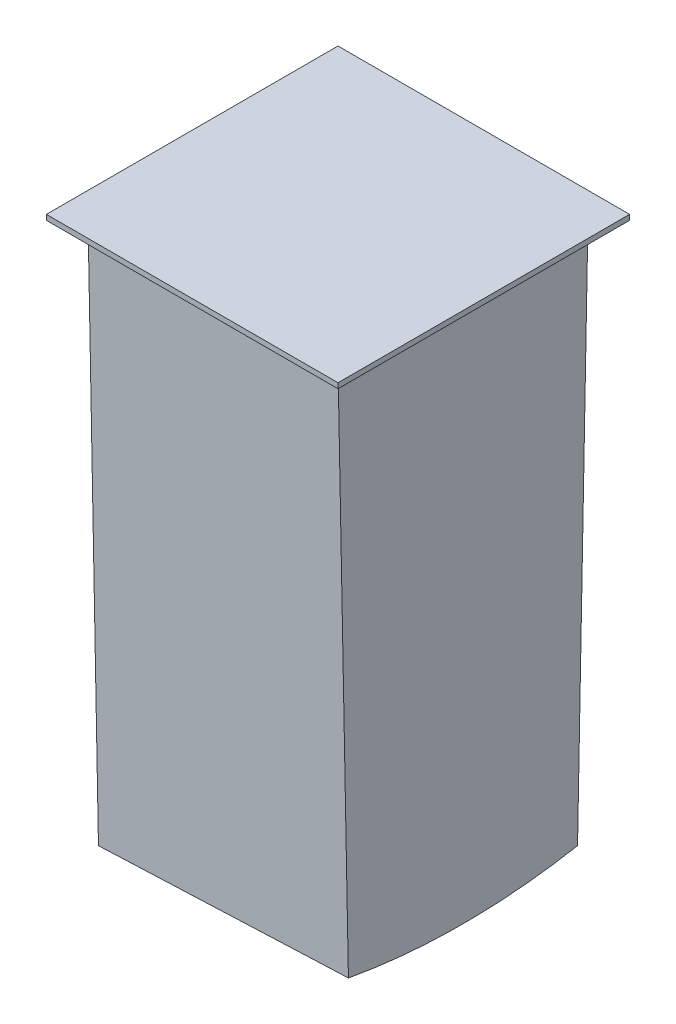
ISO-10303-21;
HEADER;
FILE_DESCRIPTION(('STEP AP214'),'2;1');
FILE_NAME('part.step','',(''),(''),'','','');
FILE_SCHEMA(('AUTOMOTIVE_DESIGN { 1 0 10303 214 1 1 1 1 }'));
ENDSEC;
DATA;
#1=APPLICATION_CONTEXT('core data for automotive mechanical design processes');
#2=APPLICATION_PROTOCOL_DEFINITION('international standard','automotive_design',2000,#1);
#3=PRODUCT_CONTEXT('',#1,'mechanical');
#4=PRODUCT('Part','Part','',(#3));
#5=PRODUCT_RELATED_PRODUCT_CATEGORY('part','',(#4));
#6=PRODUCT_DEFINITION_FORMATION('','',#4);
#7=PRODUCT_DEFINITION_CONTEXT('part definition',#1,'design');
#8=PRODUCT_DEFINITION('design','',#6,#7);
#9=PRODUCT_DEFINITION_SHAPE('','',#8);
#10=(LENGTH_UNIT() NAMED_UNIT(*) SI_UNIT(.MILLI.,.METRE.));
#11=(NAMED_UNIT(*) PLANE_ANGLE_UNIT() SI_UNIT($,.RADIAN.));
#12=(NAMED_UNIT(*) SI_UNIT($,.STERADIAN.) SOLID_ANGLE_UNIT());
#13=UNCERTAINTY_MEASURE_WITH_UNIT(LENGTH_MEASURE(1.E-05),#10,'distance_accuracy_value','');
#14=(GEOMETRIC_REPRESENTATION_CONTEXT(3) GLOBAL_UNCERTAINTY_ASSIGNED_CONTEXT((#13)) GLOBAL_UNIT_ASSIGNED_CONTEXT((#10,
#11,#12)) REPRESENTATION_CONTEXT('',''));
#15=CARTESIAN_POINT('',(0.,0.,0.));
#16=DIRECTION('',(0.,0.,1.));
#17=DIRECTION('',(1.,0.,0.));
#18=AXIS2_PLACEMENT_3D('',#15,#16,#17);
#19=CARTESIAN_POINT('',(304.8,781.544571301346,-488.316339837952));
#20=DIRECTION('',(-1.,0.,0.));
#21=DIRECTION('',(0.,0.,1.));
#22=AXIS2_PLACEMENT_3D('',#19,#20,#21);
#23=PLANE('',#22);
#24=DIRECTION('',(0.,-0.999811534110652,-0.0194138161963234));
#25=VECTOR('',#24,1.);
#26=CARTESIAN_POINT('',(304.8,673.594571301347,-335.916339837952));
#27=LINE('',#26,#25);
#28=CARTESIAN_POINT('',(304.8,673.594571301347,-335.916339837952));
#29=VERTEX_POINT('',#28);
#30=CARTESIAN_POINT('',(304.8,19.5445713013471,-348.616339837952));
#31=VERTEX_POINT('',#30);
#32=EDGE_CURVE('E53',#29,#31,#27,.T.);
#33=ORIENTED_EDGE('',*,*,#32,.T.);
#34=CARTESIAN_POINT('',(304.8,781.544571301346,-488.316339837952));
#35=DIRECTION('',(1.,0.,0.));
#36=DIRECTION('',(0.,0.,1.));
#37=AXIS2_PLACEMENT_3D('',#34,#35,#36);
#38=CIRCLE('',#37,774.699999999999);
#39=CARTESIAN_POINT('',(304.8,19.5445713013472,-628.016339837952));
#40=VERTEX_POINT('',#39);
#41=EDGE_CURVE('E179',#31,#40,#38,.T.);
#42=ORIENTED_EDGE('',*,*,#41,.T.);
#43=DIRECTION('',(0.,0.999811534110652,-0.0194138161963232));
#44=VECTOR('',#43,1.);
#45=CARTESIAN_POINT('',(304.8,19.5445713013472,-628.016339837952));
#46=LINE('',#45,#44);
#47=CARTESIAN_POINT('',(304.8,673.594571301347,-640.716339837952));
#48=VERTEX_POINT('',#47);
#49=EDGE_CURVE('E85',#40,#48,#46,.T.);
#50=ORIENTED_EDGE('',*,*,#49,.T.);
#51=DIRECTION('',(0.,0.,1.));
#52=VECTOR('',#51,1.);
#53=CARTESIAN_POINT('',(304.8,673.594571301347,-640.716339837952));
#54=LINE('',#53,#52);
#55=EDGE_CURVE('E126',#48,#29,#54,.T.);
#56=ORIENTED_EDGE('',*,*,#55,.T.);
#57=EDGE_LOOP('',(#33,#42,#50,#56));
#58=FACE_BOUND('',#57,.T.);
#59=ADVANCED_FACE('F49',(#58),#23,.F.);
#60=CARTESIAN_POINT('',(0.,378.319571301347,-488.312288406467));
#61=DIRECTION('',(-1.,0.,0.));
#62=DIRECTION('',(0.,0.,1.));
#63=AXIS2_PLACEMENT_3D('',#60,#61,#62);
#64=PLANE('',#63);
#65=DIRECTION('',(0.,-0.999818643451537,-0.0190441646371723));
#66=VECTOR('',#65,1.);
#67=CARTESIAN_POINT('',(0.,673.594571301347,-335.912288406467));
#68=LINE('',#67,#66);
#69=CARTESIAN_POINT('',(0.,673.594571301347,-335.912288406467));
#70=VERTEX_POINT('',#69);
#71=CARTESIAN_POINT('',(0.,6.84457130134736,-348.612288406467));
#72=VERTEX_POINT('',#71);
#73=EDGE_CURVE('E112',#70,#72,#68,.T.);
#74=ORIENTED_EDGE('',*,*,#73,.F.);
#75=DIRECTION('',(0.,0.,1.));
#76=VECTOR('',#75,1.);
#77=CARTESIAN_POINT('',(0.,673.594571301348,-640.712288406467));
#78=LINE('',#77,#76);
#79=CARTESIAN_POINT('',(0.,673.594571301348,-640.712288406467));
#80=VERTEX_POINT('',#79);
#81=EDGE_CURVE('E12',#80,#70,#78,.T.);
#82=ORIENTED_EDGE('',*,*,#81,.F.);
#83=DIRECTION('',(0.,0.999818643451537,-0.0190441646371722));
#84=VECTOR('',#83,1.);
#85=CARTESIAN_POINT('',(0.,6.84457130134734,-628.012288406467));
#86=LINE('',#85,#84);
#87=CARTESIAN_POINT('',(0.,6.84457130134734,-628.012288406467));
#88=VERTEX_POINT('',#87);
#89=EDGE_CURVE('E60',#88,#80,#86,.T.);
#90=ORIENTED_EDGE('',*,*,#89,.F.);
#91=CARTESIAN_POINT('',(0.,378.319571301347,-488.312288406467));
#92=DIRECTION('',(1.,0.,0.));
#93=DIRECTION('',(0.,0.,1.));
#94=AXIS2_PLACEMENT_3D('',#91,#92,#93);
#95=CIRCLE('',#94,396.874999999999);
#96=EDGE_CURVE('E69',#72,#88,#95,.T.);
#97=ORIENTED_EDGE('',*,*,#96,.F.);
#98=EDGE_LOOP('',(#74,#82,#90,#97));
#99=FACE_BOUND('',#98,.T.);
#100=ADVANCED_FACE('F120',(#99),#64,.T.);
#101=CARTESIAN_POINT('',(0.,6.84457130134734,-628.012288406467));
#102=CARTESIAN_POINT('',(304.8,19.5445713013472,-628.016339837952));
#103=CARTESIAN_POINT('',(0.,117.969571301347,-630.128955073133));
#104=CARTESIAN_POINT('',(304.8,128.552904634681,-630.133006504618));
#105=CARTESIAN_POINT('',(0.,229.094571301347,-632.2456217398));
#106=CARTESIAN_POINT('',(304.8,237.561237968015,-632.249673171285));
#107=CARTESIAN_POINT('',(0.,451.344571301347,-636.478955073133));
#108=CARTESIAN_POINT('',(304.8,455.577904634681,-636.483006504618));
#109=CARTESIAN_POINT('',(0.,562.469571301347,-638.5956217398));
#110=CARTESIAN_POINT('',(304.8,564.586237968014,-638.599673171285));
#111=CARTESIAN_POINT('',(0.,673.594571301348,-640.712288406467));
#112=CARTESIAN_POINT('',(304.8,673.594571301347,-640.716339837952));
#113=B_SPLINE_SURFACE_WITH_KNOTS('',3,1,((#101,#102),(#103,#104),(#105,#106),(#107,#108),(#109,
#110),(#111,#112)),.UNSPECIFIED.,.F.,.F.,.F.,(4,2,4),(2,2),(0.,0.5,1.),(0.,1.),.UNSPECIFIED.);
#114=DIRECTION('',(0.99999999991166,0.,-1.32920980458787E-05));
#115=VECTOR('',#114,1.);
#116=CARTESIAN_POINT('',(0.,673.594571301348,-640.712288406467));
#117=LINE('',#116,#115);
#118=EDGE_CURVE('E91',#80,#48,#117,.T.);
#119=DIRECTION('',(0.999133073004241,0.0416305447085098,-1.32805747687896E-05));
#120=VECTOR('',#119,1.);
#121=CARTESIAN_POINT('',(152.4,13.1945713013473,-628.014314122209));
#122=LINE('',#121,#120);
#123=EDGE_CURVE('E323',#88,#40,#122,.T.);
#124=ORIENTED_EDGE('',*,*,#89,.T.);
#125=ORIENTED_EDGE('',*,*,#118,.T.);
#126=ORIENTED_EDGE('',*,*,#49,.F.);
#127=ORIENTED_EDGE('',*,*,#123,.F.);
#128=EDGE_LOOP('',(#124,#125,#126,#127));
#129=FACE_BOUND('',#128,.T.);
#130=ADVANCED_FACE('F152',(#129),#113,.T.);
#131=CARTESIAN_POINT('',(0.,673.594571301347,-335.912288406467));
#132=CARTESIAN_POINT('',(304.8,673.594571301347,-335.916339837952));
#133=CARTESIAN_POINT('',(0.,562.469571301345,-338.028955073133));
#134=CARTESIAN_POINT('',(304.8,564.586237968014,-338.033006504618));
#135=CARTESIAN_POINT('',(0.,451.344571301344,-340.1456217398));
#136=CARTESIAN_POINT('',(304.8,455.577904634681,-340.149673171285));
#137=CARTESIAN_POINT('',(0.,229.094571301344,-344.378955073133));
#138=CARTESIAN_POINT('',(304.8,237.561237968014,-344.383006504618));
#139=CARTESIAN_POINT('',(0.,117.969571301345,-346.4956217398));
#140=CARTESIAN_POINT('',(304.8,128.552904634681,-346.499673171285));
#141=CARTESIAN_POINT('',(0.,6.84457130134764,-348.612288406467));
#142=CARTESIAN_POINT('',(304.8,19.5445713013471,-348.616339837952));
#143=B_SPLINE_SURFACE_WITH_KNOTS('',3,1,((#131,#132),(#133,#134),(#135,#136),(#137,#138),(#139,
#140),(#141,#142)),.UNSPECIFIED.,.F.,.F.,.F.,(4,2,4),(2,2),(0.,0.5,1.),(0.,1.),.UNSPECIFIED.);
#144=DIRECTION('',(0.999133073004242,0.0416305447085084,-1.32805747686077E-05));
#145=VECTOR('',#144,1.);
#146=CARTESIAN_POINT('',(152.4,13.1945713013474,-348.614314122209));
#147=LINE('',#146,#145);
#148=EDGE_CURVE('E117',#72,#31,#147,.T.);
#149=DIRECTION('',(0.99999999991166,0.,-1.3292098046243E-05));
#150=VECTOR('',#149,1.);
#151=CARTESIAN_POINT('',(0.,673.594571301347,-335.912288406467));
#152=LINE('',#151,#150);
#153=EDGE_CURVE('E110',#70,#29,#152,.T.);
#154=ORIENTED_EDGE('',*,*,#73,.T.);
#155=ORIENTED_EDGE('',*,*,#148,.T.);
#156=ORIENTED_EDGE('',*,*,#32,.F.);
#157=ORIENTED_EDGE('',*,*,#153,.F.);
#158=EDGE_LOOP('',(#154,#155,#156,#157));
#159=FACE_BOUND('',#158,.T.);
#160=ADVANCED_FACE('F111',(#159),#143,.T.);
#161=CARTESIAN_POINT('',(0.,6.84457130134736,-348.612288406467));
#162=CARTESIAN_POINT('',(304.8,19.5445713013471,-348.616339837952));
#163=CARTESIAN_POINT('',(0.,2.74670463468069,-359.508888406467));
#164=CARTESIAN_POINT('',(304.8,17.4452543614564,-360.067159510083));
#165=CARTESIAN_POINT('',(0.,-0.903766893831396,-370.673732669421));
#166=CARTESIAN_POINT('',(304.8,15.6002562036643,-371.588957469484));
#167=CARTESIAN_POINT('',(0.,-7.22636028035017,-393.425489173939));
#168=CARTESIAN_POINT('',(304.8,12.4285763096319,-394.739830128901));
#169=CARTESIAN_POINT('',(0.,-9.89834167007611,-405.012268250595));
#170=CARTESIAN_POINT('',(304.8,11.1018945733917,-406.368904828918));
#171=CARTESIAN_POINT('',(0.,-14.200220645262,-428.4770626607));
#172=CARTESIAN_POINT('',(304.8,8.97652637981816,-429.699651135646));
#173=CARTESIAN_POINT('',(0.,-15.8300150875711,-440.35490717573));
#174=CARTESIAN_POINT('',(304.8,8.17786658600373,-441.401227205624));
#175=CARTESIAN_POINT('',(0.,-18.0076464334456,-464.259360358853));
#176=CARTESIAN_POINT('',(304.8,7.11188904676826,-464.840632162837));
#177=CARTESIAN_POINT('',(0.,-18.5554286986527,-476.285773254952));
#178=CARTESIAN_POINT('',(304.8,6.84457130134721,-476.578461050073));
#179=CARTESIAN_POINT('',(0.,-18.5554286986527,-500.338803557982));
#180=CARTESIAN_POINT('',(304.8,6.84457130134722,-500.054218625831));
#181=CARTESIAN_POINT('',(0.,-18.0076464334456,-512.365216454081));
#182=CARTESIAN_POINT('',(304.8,7.11188904676828,-511.792047513066));
#183=CARTESIAN_POINT('',(0.,-15.8300150875711,-536.269669637203));
#184=CARTESIAN_POINT('',(304.8,8.17786658600376,-535.23145247028));
#185=CARTESIAN_POINT('',(0.,-14.200220645262,-548.147514152234));
#186=CARTESIAN_POINT('',(304.8,8.9765263798182,-546.933028540258));
#187=CARTESIAN_POINT('',(0.,-9.89834167007615,-571.612308562339));
#188=CARTESIAN_POINT('',(304.8,11.1018945733917,-570.263774846986));
#189=CARTESIAN_POINT('',(0.,-7.22636028035022,-583.199087638995));
#190=CARTESIAN_POINT('',(304.8,12.4285763096319,-581.892849547003));
#191=CARTESIAN_POINT('',(0.,-0.903766893831449,-605.950844143513));
#192=CARTESIAN_POINT('',(304.8,15.6002562036643,-605.04372220642));
#193=CARTESIAN_POINT('',(0.,2.74670463468063,-617.115688406467));
#194=CARTESIAN_POINT('',(304.8,17.4452543614565,-616.565520165821));
#195=CARTESIAN_POINT('',(0.,6.84457130134731,-628.012288406467));
#196=CARTESIAN_POINT('',(304.8,19.5445713013472,-628.016339837952));
#197=B_SPLINE_SURFACE_WITH_KNOTS('',3,1,((#161,#162),(#163,#164),(#165,#166),(#167,#168),(#169,
#170),(#171,#172),(#173,#174),(#175,#176),(#177,#178),(#179,#180),(#181,#182),(#183,#184),(#185,
#186),(#187,#188),(#189,#190),(#191,#192),(#193,#194),(#195,#196)),.UNSPECIFIED.,.F.,.F.,.F.,(4,
2,2,2,2,2,2,2,4),(2,2),(0.,0.125,0.25,0.375,0.5,0.625,0.75,0.875,1.),(0.,1.),.UNSPECIFIED.);
#198=ORIENTED_EDGE('',*,*,#96,.T.);
#199=ORIENTED_EDGE('',*,*,#123,.T.);
#200=ORIENTED_EDGE('',*,*,#41,.F.);
#201=ORIENTED_EDGE('',*,*,#148,.F.);
#202=EDGE_LOOP('',(#198,#199,#200,#201));
#203=FACE_BOUND('',#202,.T.);
#204=ADVANCED_FACE('F151',(#203),#197,.T.);
#205=CARTESIAN_POINT('',(-25.4,679.944571301347,-666.114314122209));
#206=DIRECTION('',(1.,0.,0.));
#207=DIRECTION('',(0.,1.,0.));
#208=AXIS2_PLACEMENT_3D('',#205,#206,#207);
#209=PLANE('',#208);
#210=DIRECTION('',(0.,0.,1.));
#211=VECTOR('',#210,1.);
#212=CARTESIAN_POINT('',(-25.4,673.594571301348,-666.114314122209));
#213=LINE('',#212,#211);
#214=CARTESIAN_POINT('',(-25.4,673.594571301348,-666.114314122209));
#215=VERTEX_POINT('',#214);
#216=CARTESIAN_POINT('',(-25.4,673.594571301347,-310.514314122209));
#217=VERTEX_POINT('',#216);
#218=EDGE_CURVE('E267',#215,#217,#213,.T.);
#219=ORIENTED_EDGE('',*,*,#218,.T.);
#220=DIRECTION('',(0.,-1.,0.));
#221=VECTOR('',#220,1.);
#222=CARTESIAN_POINT('',(-25.4,679.944571301347,-310.514314122209));
#223=LINE('',#222,#221);
#224=CARTESIAN_POINT('',(-25.4,679.944571301347,-310.514314122209));
#225=VERTEX_POINT('',#224);
#226=EDGE_CURVE('E130',#225,#217,#223,.T.);
#227=ORIENTED_EDGE('',*,*,#226,.F.);
#228=DIRECTION('',(0.,0.,1.));
#229=VECTOR('',#228,1.);
#230=CARTESIAN_POINT('',(-25.4,679.944571301347,-666.114314122209));
#231=LINE('',#230,#229);
#232=CARTESIAN_POINT('',(-25.4,679.944571301347,-666.114314122209));
#233=VERTEX_POINT('',#232);
#234=EDGE_CURVE('E262',#233,#225,#231,.T.);
#235=ORIENTED_EDGE('',*,*,#234,.F.);
#236=DIRECTION('',(0.,-1.,0.));
#237=VECTOR('',#236,1.);
#238=CARTESIAN_POINT('',(-25.4,679.944571301347,-666.114314122209));
#239=LINE('',#238,#237);
#240=EDGE_CURVE('E253',#233,#215,#239,.T.);
#241=ORIENTED_EDGE('',*,*,#240,.T.);
#242=EDGE_LOOP('',(#219,#227,#235,#241));
#243=FACE_BOUND('',#242,.T.);
#244=ADVANCED_FACE('F286',(#243),#209,.F.);
#245=CARTESIAN_POINT('',(-25.4,679.944571301347,-310.514314122209));
#246=DIRECTION('',(0.,0.,-1.));
#247=DIRECTION('',(0.,1.,0.));
#248=AXIS2_PLACEMENT_3D('',#245,#246,#247);
#249=PLANE('',#248);
#250=DIRECTION('',(1.,0.,0.));
#251=VECTOR('',#250,1.);
#252=CARTESIAN_POINT('',(-25.4,673.594571301347,-310.514314122209));
#253=LINE('',#252,#251);
#254=CARTESIAN_POINT('',(330.2,673.594571301347,-310.514314122209));
#255=VERTEX_POINT('',#254);
#256=EDGE_CURVE('E265',#217,#255,#253,.T.);
#257=ORIENTED_EDGE('',*,*,#256,.T.);
#258=DIRECTION('',(0.,-1.,0.));
#259=VECTOR('',#258,1.);
#260=CARTESIAN_POINT('',(330.2,679.944571301347,-310.514314122209));
#261=LINE('',#260,#259);
#262=CARTESIAN_POINT('',(330.2,679.944571301347,-310.514314122209));
#263=VERTEX_POINT('',#262);
#264=EDGE_CURVE('E237',#263,#255,#261,.T.);
#265=ORIENTED_EDGE('',*,*,#264,.F.);
#266=DIRECTION('',(1.,0.,0.));
#267=VECTOR('',#266,1.);
#268=CARTESIAN_POINT('',(-25.4,679.944571301347,-310.514314122209));
#269=LINE('',#268,#267);
#270=EDGE_CURVE('E273',#225,#263,#269,.T.);
#271=ORIENTED_EDGE('',*,*,#270,.F.);
#272=ORIENTED_EDGE('',*,*,#226,.T.);
#273=EDGE_LOOP('',(#257,#265,#271,#272));
#274=FACE_BOUND('',#273,.T.);
#275=ADVANCED_FACE('F306',(#274),#249,.F.);
#276=CARTESIAN_POINT('',(330.2,679.944571301347,-666.114314122209));
#277=DIRECTION('',(-1.,0.,0.));
#278=DIRECTION('',(0.,-1.,0.));
#279=AXIS2_PLACEMENT_3D('',#276,#277,#278);
#280=PLANE('',#279);
#281=DIRECTION('',(0.,0.,-1.));
#282=VECTOR('',#281,1.);
#283=CARTESIAN_POINT('',(330.2,673.594571301347,-666.114314122209));
#284=LINE('',#283,#282);
#285=CARTESIAN_POINT('',(330.2,673.594571301347,-666.114314122209));
#286=VERTEX_POINT('',#285);
#287=EDGE_CURVE('E263',#255,#286,#284,.T.);
#288=ORIENTED_EDGE('',*,*,#287,.T.);
#289=DIRECTION('',(0.,-1.,0.));
#290=VECTOR('',#289,1.);
#291=CARTESIAN_POINT('',(330.2,679.944571301347,-666.114314122209));
#292=LINE('',#291,#290);
#293=CARTESIAN_POINT('',(330.2,679.944571301347,-666.114314122209));
#294=VERTEX_POINT('',#293);
#295=EDGE_CURVE('E245',#294,#286,#292,.T.);
#296=ORIENTED_EDGE('',*,*,#295,.F.);
#297=DIRECTION('',(0.,0.,-1.));
#298=VECTOR('',#297,1.);
#299=CARTESIAN_POINT('',(330.2,679.944571301347,-666.114314122209));
#300=LINE('',#299,#298);
#301=EDGE_CURVE('E270',#263,#294,#300,.T.);
#302=ORIENTED_EDGE('',*,*,#301,.F.);
#303=ORIENTED_EDGE('',*,*,#264,.T.);
#304=EDGE_LOOP('',(#288,#296,#302,#303));
#305=FACE_BOUND('',#304,.T.);
#306=ADVANCED_FACE('F297',(#305),#280,.F.);
#307=CARTESIAN_POINT('',(-25.4,679.944571301347,-666.114314122209));
#308=DIRECTION('',(0.,0.,1.));
#309=DIRECTION('',(0.,-1.,0.));
#310=AXIS2_PLACEMENT_3D('',#307,#308,#309);
#311=PLANE('',#310);
#312=DIRECTION('',(-1.,0.,0.));
#313=VECTOR('',#312,1.);
#314=CARTESIAN_POINT('',(-25.4,673.594571301348,-666.114314122209));
#315=LINE('',#314,#313);
#316=EDGE_CURVE('E259',#286,#215,#315,.T.);
#317=ORIENTED_EDGE('',*,*,#316,.T.);
#318=ORIENTED_EDGE('',*,*,#240,.F.);
#319=DIRECTION('',(-1.,0.,0.));
#320=VECTOR('',#319,1.);
#321=CARTESIAN_POINT('',(-25.4,679.944571301347,-666.114314122209));
#322=LINE('',#321,#320);
#323=EDGE_CURVE('E258',#294,#233,#322,.T.);
#324=ORIENTED_EDGE('',*,*,#323,.F.);
#325=ORIENTED_EDGE('',*,*,#295,.T.);
#326=EDGE_LOOP('',(#317,#318,#324,#325));
#327=FACE_BOUND('',#326,.T.);
#328=ADVANCED_FACE('F298',(#327),#311,.F.);
#329=CARTESIAN_POINT('',(-25.4,679.944571301347,-310.514314122209));
#330=DIRECTION('',(0.,1.,0.));
#331=DIRECTION('',(-1.,0.,0.));
#332=AXIS2_PLACEMENT_3D('',#329,#330,#331);
#333=PLANE('',#332);
#334=ORIENTED_EDGE('',*,*,#234,.T.);
#335=ORIENTED_EDGE('',*,*,#270,.T.);
#336=ORIENTED_EDGE('',*,*,#301,.T.);
#337=ORIENTED_EDGE('',*,*,#323,.T.);
#338=EDGE_LOOP('',(#334,#335,#336,#337));
#339=FACE_BOUND('',#338,.T.);
#340=ADVANCED_FACE('F280',(#339),#333,.T.);
#341=CARTESIAN_POINT('',(-25.4,673.594571301347,-310.514314122209));
#342=DIRECTION('',(0.,1.,0.));
#343=DIRECTION('',(-1.,0.,0.));
#344=AXIS2_PLACEMENT_3D('',#341,#342,#343);
#345=PLANE('',#344);
#346=ORIENTED_EDGE('',*,*,#118,.F.);
#347=ORIENTED_EDGE('',*,*,#81,.T.);
#348=ORIENTED_EDGE('',*,*,#153,.T.);
#349=ORIENTED_EDGE('',*,*,#55,.F.);
#350=EDGE_LOOP('',(#346,#347,#348,#349));
#351=FACE_BOUND('',#350,.T.);
#352=ORIENTED_EDGE('',*,*,#218,.F.);
#353=ORIENTED_EDGE('',*,*,#316,.F.);
#354=ORIENTED_EDGE('',*,*,#287,.F.);
#355=ORIENTED_EDGE('',*,*,#256,.F.);
#356=EDGE_LOOP('',(#352,#353,#354,#355));
#357=FACE_BOUND('',#356,.T.);
#358=ADVANCED_FACE('F124',(#351,#357),#345,.F.);
#359=CLOSED_SHELL('',(#59,#100,#130,#160,#204,#244,#275,#306,#328,#340,#358));
#360=MANIFOLD_SOLID_BREP('B2',#359);
#361=ADVANCED_BREP_SHAPE_REPRESENTATION('',(#18,#360),#14);
#362=SHAPE_DEFINITION_REPRESENTATION(#9,#361);
ENDSEC;
END-ISO-10303-21;
